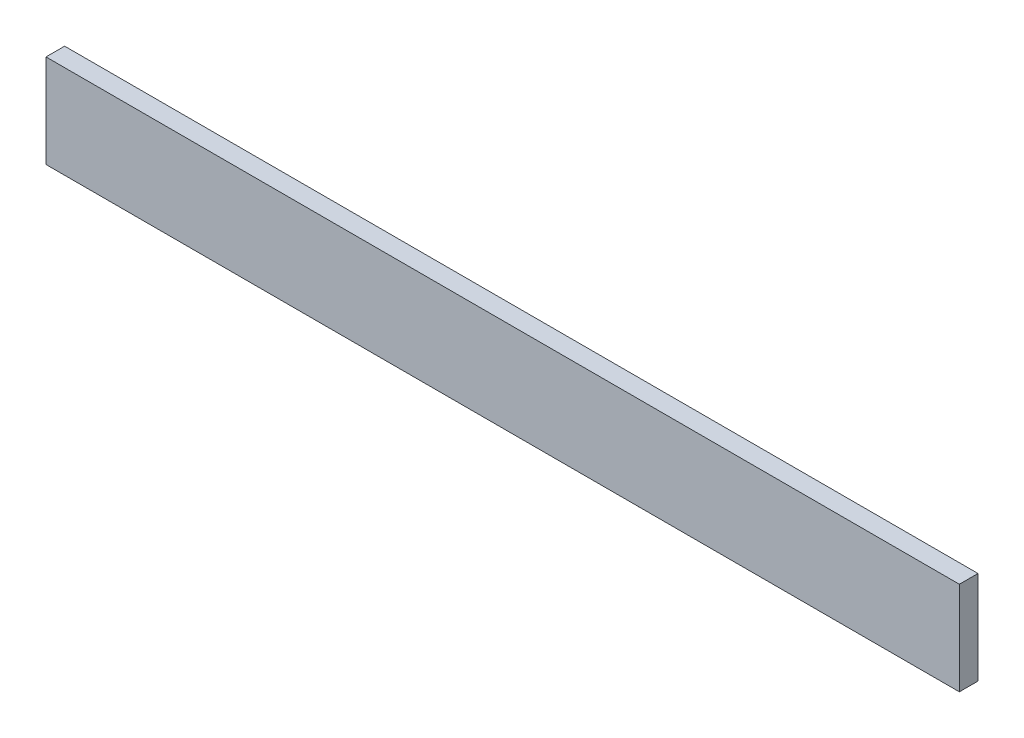
ISO-10303-21;
HEADER;
FILE_DESCRIPTION(('STEP AP214'),'2;1');
FILE_NAME('part.step','',(''),(''),'','','');
FILE_SCHEMA(('AUTOMOTIVE_DESIGN { 1 0 10303 214 1 1 1 1 }'));
ENDSEC;
DATA;
#1=APPLICATION_CONTEXT('core data for automotive mechanical design processes');
#2=APPLICATION_PROTOCOL_DEFINITION('international standard','automotive_design',2000,#1);
#3=PRODUCT_CONTEXT('',#1,'mechanical');
#4=PRODUCT('Part','Part','',(#3));
#5=PRODUCT_RELATED_PRODUCT_CATEGORY('part','',(#4));
#6=PRODUCT_DEFINITION_FORMATION('','',#4);
#7=PRODUCT_DEFINITION_CONTEXT('part definition',#1,'design');
#8=PRODUCT_DEFINITION('design','',#6,#7);
#9=PRODUCT_DEFINITION_SHAPE('','',#8);
#10=(LENGTH_UNIT() NAMED_UNIT(*) SI_UNIT(.MILLI.,.METRE.));
#11=(NAMED_UNIT(*) PLANE_ANGLE_UNIT() SI_UNIT($,.RADIAN.));
#12=(NAMED_UNIT(*) SI_UNIT($,.STERADIAN.) SOLID_ANGLE_UNIT());
#13=UNCERTAINTY_MEASURE_WITH_UNIT(LENGTH_MEASURE(1.E-05),#10,'distance_accuracy_value','');
#14=(GEOMETRIC_REPRESENTATION_CONTEXT(3) GLOBAL_UNCERTAINTY_ASSIGNED_CONTEXT((#13)) GLOBAL_UNIT_ASSIGNED_CONTEXT((#10,
#11,#12)) REPRESENTATION_CONTEXT('',''));
#15=CARTESIAN_POINT('',(0.,0.,0.));
#16=DIRECTION('',(0.,0.,1.));
#17=DIRECTION('',(1.,0.,0.));
#18=AXIS2_PLACEMENT_3D('',#15,#16,#17);
#19=CARTESIAN_POINT('',(73.5,-7.5,3.));
#20=DIRECTION('',(-1.,0.,0.));
#21=DIRECTION('',(0.,0.,1.));
#22=AXIS2_PLACEMENT_3D('',#19,#20,#21);
#23=PLANE('',#22);
#24=DIRECTION('',(0.,1.,0.));
#25=VECTOR('',#24,1.);
#26=CARTESIAN_POINT('',(73.5,-7.5,0.));
#27=LINE('',#26,#25);
#28=CARTESIAN_POINT('',(73.5,-7.5,0.));
#29=VERTEX_POINT('',#28);
#30=CARTESIAN_POINT('',(73.5,7.5,0.));
#31=VERTEX_POINT('',#30);
#32=EDGE_CURVE('E96',#29,#31,#27,.T.);
#33=ORIENTED_EDGE('',*,*,#32,.T.);
#34=DIRECTION('',(0.,0.,-1.));
#35=VECTOR('',#34,1.);
#36=CARTESIAN_POINT('',(73.5,7.5,3.));
#37=LINE('',#36,#35);
#38=CARTESIAN_POINT('',(73.5,7.5,3.));
#39=VERTEX_POINT('',#38);
#40=EDGE_CURVE('E11',#39,#31,#37,.T.);
#41=ORIENTED_EDGE('',*,*,#40,.F.);
#42=DIRECTION('',(0.,1.,0.));
#43=VECTOR('',#42,1.);
#44=CARTESIAN_POINT('',(73.5,-7.5,3.));
#45=LINE('',#44,#43);
#46=CARTESIAN_POINT('',(73.5,-7.5,3.));
#47=VERTEX_POINT('',#46);
#48=EDGE_CURVE('E84',#47,#39,#45,.T.);
#49=ORIENTED_EDGE('',*,*,#48,.F.);
#50=DIRECTION('',(0.,0.,-1.));
#51=VECTOR('',#50,1.);
#52=CARTESIAN_POINT('',(73.5,-7.5,3.));
#53=LINE('',#52,#51);
#54=EDGE_CURVE('E92',#47,#29,#53,.T.);
#55=ORIENTED_EDGE('',*,*,#54,.T.);
#56=EDGE_LOOP('',(#33,#41,#49,#55));
#57=FACE_BOUND('',#56,.T.);
#58=ADVANCED_FACE('F33',(#57),#23,.F.);
#59=CARTESIAN_POINT('',(-73.5,7.5,3.));
#60=DIRECTION('',(0.,-1.,0.));
#61=DIRECTION('',(0.,0.,-1.));
#62=AXIS2_PLACEMENT_3D('',#59,#60,#61);
#63=PLANE('',#62);
#64=DIRECTION('',(-1.,0.,0.));
#65=VECTOR('',#64,1.);
#66=CARTESIAN_POINT('',(-73.5,7.5,0.));
#67=LINE('',#66,#65);
#68=CARTESIAN_POINT('',(-73.5,7.5,0.));
#69=VERTEX_POINT('',#68);
#70=EDGE_CURVE('E88',#31,#69,#67,.T.);
#71=ORIENTED_EDGE('',*,*,#70,.T.);
#72=DIRECTION('',(0.,0.,-1.));
#73=VECTOR('',#72,1.);
#74=CARTESIAN_POINT('',(-73.5,7.5,3.));
#75=LINE('',#74,#73);
#76=CARTESIAN_POINT('',(-73.5,7.5,3.));
#77=VERTEX_POINT('',#76);
#78=EDGE_CURVE('E41',#77,#69,#75,.T.);
#79=ORIENTED_EDGE('',*,*,#78,.F.);
#80=DIRECTION('',(-1.,0.,0.));
#81=VECTOR('',#80,1.);
#82=CARTESIAN_POINT('',(-73.5,7.5,3.));
#83=LINE('',#82,#81);
#84=EDGE_CURVE('E79',#39,#77,#83,.T.);
#85=ORIENTED_EDGE('',*,*,#84,.F.);
#86=ORIENTED_EDGE('',*,*,#40,.T.);
#87=EDGE_LOOP('',(#71,#79,#85,#86));
#88=FACE_BOUND('',#87,.T.);
#89=ADVANCED_FACE('F87',(#88),#63,.F.);
#90=CARTESIAN_POINT('',(-73.5,-7.5,3.));
#91=DIRECTION('',(1.,0.,0.));
#92=DIRECTION('',(0.,0.,-1.));
#93=AXIS2_PLACEMENT_3D('',#90,#91,#92);
#94=PLANE('',#93);
#95=DIRECTION('',(0.,-1.,0.));
#96=VECTOR('',#95,1.);
#97=CARTESIAN_POINT('',(-73.5,-7.5,0.));
#98=LINE('',#97,#96);
#99=CARTESIAN_POINT('',(-73.5,-7.5,0.));
#100=VERTEX_POINT('',#99);
#101=EDGE_CURVE('E66',#69,#100,#98,.T.);
#102=ORIENTED_EDGE('',*,*,#101,.T.);
#103=DIRECTION('',(0.,0.,-1.));
#104=VECTOR('',#103,1.);
#105=CARTESIAN_POINT('',(-73.5,-7.5,3.));
#106=LINE('',#105,#104);
#107=CARTESIAN_POINT('',(-73.5,-7.5,3.));
#108=VERTEX_POINT('',#107);
#109=EDGE_CURVE('E89',#108,#100,#106,.T.);
#110=ORIENTED_EDGE('',*,*,#109,.F.);
#111=DIRECTION('',(0.,-1.,0.));
#112=VECTOR('',#111,1.);
#113=CARTESIAN_POINT('',(-73.5,-7.5,3.));
#114=LINE('',#113,#112);
#115=EDGE_CURVE('E82',#77,#108,#114,.T.);
#116=ORIENTED_EDGE('',*,*,#115,.F.);
#117=ORIENTED_EDGE('',*,*,#78,.T.);
#118=EDGE_LOOP('',(#102,#110,#116,#117));
#119=FACE_BOUND('',#118,.T.);
#120=ADVANCED_FACE('F90',(#119),#94,.F.);
#121=CARTESIAN_POINT('',(-73.5,-7.5,3.));
#122=DIRECTION('',(0.,1.,0.));
#123=DIRECTION('',(0.,0.,1.));
#124=AXIS2_PLACEMENT_3D('',#121,#122,#123);
#125=PLANE('',#124);
#126=DIRECTION('',(1.,0.,0.));
#127=VECTOR('',#126,1.);
#128=CARTESIAN_POINT('',(-73.5,-7.5,0.));
#129=LINE('',#128,#127);
#130=EDGE_CURVE('E72',#100,#29,#129,.T.);
#131=ORIENTED_EDGE('',*,*,#130,.T.);
#132=ORIENTED_EDGE('',*,*,#54,.F.);
#133=DIRECTION('',(1.,0.,0.));
#134=VECTOR('',#133,1.);
#135=CARTESIAN_POINT('',(-73.5,-7.5,3.));
#136=LINE('',#135,#134);
#137=EDGE_CURVE('E49',#108,#47,#136,.T.);
#138=ORIENTED_EDGE('',*,*,#137,.F.);
#139=ORIENTED_EDGE('',*,*,#109,.T.);
#140=EDGE_LOOP('',(#131,#132,#138,#139));
#141=FACE_BOUND('',#140,.T.);
#142=ADVANCED_FACE('F103',(#141),#125,.F.);
#143=CARTESIAN_POINT('',(0.,0.,3.));
#144=DIRECTION('',(0.,0.,-1.));
#145=DIRECTION('',(-1.,0.,0.));
#146=AXIS2_PLACEMENT_3D('',#143,#144,#145);
#147=PLANE('',#146);
#148=ORIENTED_EDGE('',*,*,#48,.T.);
#149=ORIENTED_EDGE('',*,*,#84,.T.);
#150=ORIENTED_EDGE('',*,*,#115,.T.);
#151=ORIENTED_EDGE('',*,*,#137,.T.);
#152=EDGE_LOOP('',(#148,#149,#150,#151));
#153=FACE_BOUND('',#152,.T.);
#154=ADVANCED_FACE('F80',(#153),#147,.F.);
#155=CARTESIAN_POINT('',(0.,0.,0.));
#156=DIRECTION('',(0.,0.,-1.));
#157=DIRECTION('',(-1.,0.,0.));
#158=AXIS2_PLACEMENT_3D('',#155,#156,#157);
#159=PLANE('',#158);
#160=ORIENTED_EDGE('',*,*,#32,.F.);
#161=ORIENTED_EDGE('',*,*,#130,.F.);
#162=ORIENTED_EDGE('',*,*,#101,.F.);
#163=ORIENTED_EDGE('',*,*,#70,.F.);
#164=EDGE_LOOP('',(#160,#161,#162,#163));
#165=FACE_BOUND('',#164,.T.);
#166=ADVANCED_FACE('F106',(#165),#159,.T.);
#167=CLOSED_SHELL('',(#58,#89,#120,#142,#154,#166));
#168=MANIFOLD_SOLID_BREP('B2',#167);
#169=ADVANCED_BREP_SHAPE_REPRESENTATION('',(#18,#168),#14);
#170=SHAPE_DEFINITION_REPRESENTATION(#9,#169);
ENDSEC;
END-ISO-10303-21;
